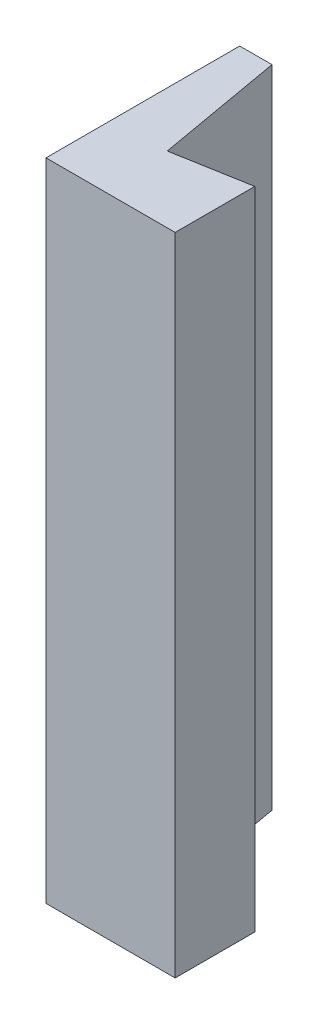
ISO-10303-21;
HEADER;
FILE_DESCRIPTION(('STEP AP214'),'2;1');
FILE_NAME('part.step','',(''),(''),'','','');
FILE_SCHEMA(('AUTOMOTIVE_DESIGN { 1 0 10303 214 1 1 1 1 }'));
ENDSEC;
DATA;
#1=APPLICATION_CONTEXT('core data for automotive mechanical design processes');
#2=APPLICATION_PROTOCOL_DEFINITION('international standard','automotive_design',2000,#1);
#3=PRODUCT_CONTEXT('',#1,'mechanical');
#4=PRODUCT('Part','Part','',(#3));
#5=PRODUCT_RELATED_PRODUCT_CATEGORY('part','',(#4));
#6=PRODUCT_DEFINITION_FORMATION('','',#4);
#7=PRODUCT_DEFINITION_CONTEXT('part definition',#1,'design');
#8=PRODUCT_DEFINITION('design','',#6,#7);
#9=PRODUCT_DEFINITION_SHAPE('','',#8);
#10=(LENGTH_UNIT() NAMED_UNIT(*) SI_UNIT(.MILLI.,.METRE.));
#11=(NAMED_UNIT(*) PLANE_ANGLE_UNIT() SI_UNIT($,.RADIAN.));
#12=(NAMED_UNIT(*) SI_UNIT($,.STERADIAN.) SOLID_ANGLE_UNIT());
#13=UNCERTAINTY_MEASURE_WITH_UNIT(LENGTH_MEASURE(1.E-05),#10,'distance_accuracy_value','');
#14=(GEOMETRIC_REPRESENTATION_CONTEXT(3) GLOBAL_UNCERTAINTY_ASSIGNED_CONTEXT((#13)) GLOBAL_UNIT_ASSIGNED_CONTEXT((#10,
#11,#12)) REPRESENTATION_CONTEXT('',''));
#15=CARTESIAN_POINT('',(0.,0.,0.));
#16=DIRECTION('',(0.,0.,1.));
#17=DIRECTION('',(1.,0.,0.));
#18=AXIS2_PLACEMENT_3D('',#15,#16,#17);
#19=CARTESIAN_POINT('',(-12.7,127.,19.05));
#20=DIRECTION('',(1.,0.,0.));
#21=DIRECTION('',(0.,0.,-1.));
#22=AXIS2_PLACEMENT_3D('',#19,#20,#21);
#23=PLANE('',#22);
#24=DIRECTION('',(0.,0.,1.));
#25=VECTOR('',#24,1.);
#26=CARTESIAN_POINT('',(-12.7,0.,19.05));
#27=LINE('',#26,#25);
#28=CARTESIAN_POINT('',(-12.7,0.,-19.05));
#29=VERTEX_POINT('',#28);
#30=CARTESIAN_POINT('',(-12.7,0.,19.05));
#31=VERTEX_POINT('',#30);
#32=EDGE_CURVE('E117',#29,#31,#27,.T.);
#33=ORIENTED_EDGE('',*,*,#32,.T.);
#34=DIRECTION('',(0.,-1.,0.));
#35=VECTOR('',#34,1.);
#36=CARTESIAN_POINT('',(-12.7,127.,19.05));
#37=LINE('',#36,#35);
#38=CARTESIAN_POINT('',(-12.7,127.,19.05));
#39=VERTEX_POINT('',#38);
#40=EDGE_CURVE('E11',#39,#31,#37,.T.);
#41=ORIENTED_EDGE('',*,*,#40,.F.);
#42=DIRECTION('',(0.,0.,1.));
#43=VECTOR('',#42,1.);
#44=CARTESIAN_POINT('',(-12.7,127.,19.05));
#45=LINE('',#44,#43);
#46=CARTESIAN_POINT('',(-12.7,127.,-19.05));
#47=VERTEX_POINT('',#46);
#48=EDGE_CURVE('E127',#47,#39,#45,.T.);
#49=ORIENTED_EDGE('',*,*,#48,.F.);
#50=DIRECTION('',(0.,-1.,0.));
#51=VECTOR('',#50,1.);
#52=CARTESIAN_POINT('',(-12.7,127.,-19.05));
#53=LINE('',#52,#51);
#54=EDGE_CURVE('E113',#47,#29,#53,.T.);
#55=ORIENTED_EDGE('',*,*,#54,.T.);
#56=EDGE_LOOP('',(#33,#41,#49,#55));
#57=FACE_BOUND('',#56,.T.);
#58=ADVANCED_FACE('F33',(#57),#23,.F.);
#59=CARTESIAN_POINT('',(-12.7,127.,19.05));
#60=DIRECTION('',(0.,0.,-1.));
#61=DIRECTION('',(-1.,0.,0.));
#62=AXIS2_PLACEMENT_3D('',#59,#60,#61);
#63=PLANE('',#62);
#64=DIRECTION('',(1.,0.,0.));
#65=VECTOR('',#64,1.);
#66=CARTESIAN_POINT('',(-12.7,0.,19.05));
#67=LINE('',#66,#65);
#68=CARTESIAN_POINT('',(12.7,0.,19.05));
#69=VERTEX_POINT('',#68);
#70=EDGE_CURVE('E120',#31,#69,#67,.T.);
#71=ORIENTED_EDGE('',*,*,#70,.T.);
#72=DIRECTION('',(0.,-1.,0.));
#73=VECTOR('',#72,1.);
#74=CARTESIAN_POINT('',(12.7,127.,19.05));
#75=LINE('',#74,#73);
#76=CARTESIAN_POINT('',(12.7,127.,19.05));
#77=VERTEX_POINT('',#76);
#78=EDGE_CURVE('E41',#77,#69,#75,.T.);
#79=ORIENTED_EDGE('',*,*,#78,.F.);
#80=DIRECTION('',(1.,0.,0.));
#81=VECTOR('',#80,1.);
#82=CARTESIAN_POINT('',(-12.7,127.,19.05));
#83=LINE('',#82,#81);
#84=EDGE_CURVE('E86',#39,#77,#83,.T.);
#85=ORIENTED_EDGE('',*,*,#84,.F.);
#86=ORIENTED_EDGE('',*,*,#40,.T.);
#87=EDGE_LOOP('',(#71,#79,#85,#86));
#88=FACE_BOUND('',#87,.T.);
#89=ADVANCED_FACE('F151',(#88),#63,.F.);
#90=CARTESIAN_POINT('',(12.7,127.,19.05));
#91=DIRECTION('',(-1.,0.,0.));
#92=DIRECTION('',(0.,0.,1.));
#93=AXIS2_PLACEMENT_3D('',#90,#91,#92);
#94=PLANE('',#93);
#95=DIRECTION('',(0.,0.,-1.));
#96=VECTOR('',#95,1.);
#97=CARTESIAN_POINT('',(12.7,0.,19.05));
#98=LINE('',#97,#96);
#99=CARTESIAN_POINT('',(12.7,0.,3.38280695940165));
#100=VERTEX_POINT('',#99);
#101=EDGE_CURVE('E122',#69,#100,#98,.T.);
#102=ORIENTED_EDGE('',*,*,#101,.T.);
#103=DIRECTION('',(0.,-1.,0.));
#104=VECTOR('',#103,1.);
#105=CARTESIAN_POINT('',(12.7,127.,3.38280695940165));
#106=LINE('',#105,#104);
#107=CARTESIAN_POINT('',(12.7,127.,3.38280695940165));
#108=VERTEX_POINT('',#107);
#109=EDGE_CURVE('E108',#108,#100,#106,.T.);
#110=ORIENTED_EDGE('',*,*,#109,.F.);
#111=DIRECTION('',(0.,0.,-1.));
#112=VECTOR('',#111,1.);
#113=CARTESIAN_POINT('',(12.7,127.,19.05));
#114=LINE('',#113,#112);
#115=EDGE_CURVE('E99',#77,#108,#114,.T.);
#116=ORIENTED_EDGE('',*,*,#115,.F.);
#117=ORIENTED_EDGE('',*,*,#78,.T.);
#118=EDGE_LOOP('',(#102,#110,#116,#117));
#119=FACE_BOUND('',#118,.T.);
#120=ADVANCED_FACE('F133',(#119),#94,.F.);
#121=CARTESIAN_POINT('',(-1.93933628726004,127.,5.9641169265101));
#122=DIRECTION('',(0.173648177666931,0.,0.984807753012208));
#123=DIRECTION('',(0.984807753012208,0.,-0.173648177666931));
#124=AXIS2_PLACEMENT_3D('',#121,#122,#123);
#125=PLANE('',#124);
#126=DIRECTION('',(-0.984807753012208,0.,0.173648177666931));
#127=VECTOR('',#126,1.);
#128=CARTESIAN_POINT('',(-1.93933628726004,0.,5.9641169265101));
#129=LINE('',#128,#127);
#130=CARTESIAN_POINT('',(-1.93933628726004,0.,5.9641169265101));
#131=VERTEX_POINT('',#130);
#132=EDGE_CURVE('E107',#100,#131,#129,.T.);
#133=ORIENTED_EDGE('',*,*,#132,.T.);
#134=DIRECTION('',(0.,-1.,0.));
#135=VECTOR('',#134,1.);
#136=CARTESIAN_POINT('',(-1.93933628726004,127.,5.9641169265101));
#137=LINE('',#136,#135);
#138=CARTESIAN_POINT('',(-1.93933628726004,127.,5.9641169265101));
#139=VERTEX_POINT('',#138);
#140=EDGE_CURVE('E104',#139,#131,#137,.T.);
#141=ORIENTED_EDGE('',*,*,#140,.F.);
#142=DIRECTION('',(-0.984807753012208,0.,0.173648177666931));
#143=VECTOR('',#142,1.);
#144=CARTESIAN_POINT('',(-1.93933628726004,127.,5.9641169265101));
#145=LINE('',#144,#143);
#146=EDGE_CURVE('E93',#108,#139,#145,.T.);
#147=ORIENTED_EDGE('',*,*,#146,.F.);
#148=ORIENTED_EDGE('',*,*,#109,.T.);
#149=EDGE_LOOP('',(#133,#141,#147,#148));
#150=FACE_BOUND('',#149,.T.);
#151=ADVANCED_FACE('F105',(#150),#125,.F.);
#152=CARTESIAN_POINT('',(-6.34999999999999,127.,-19.05));
#153=DIRECTION('',(-0.984807753012209,0.,0.173648177666927));
#154=DIRECTION('',(0.173648177666927,0.,0.984807753012209));
#155=AXIS2_PLACEMENT_3D('',#152,#153,#154);
#156=PLANE('',#155);
#157=DIRECTION('',(-0.173648177666927,0.,-0.984807753012209));
#158=VECTOR('',#157,1.);
#159=CARTESIAN_POINT('',(-6.34999999999999,0.,-19.05));
#160=LINE('',#159,#158);
#161=CARTESIAN_POINT('',(-6.34999999999999,0.,-19.05));
#162=VERTEX_POINT('',#161);
#163=EDGE_CURVE('E72',#131,#162,#160,.T.);
#164=ORIENTED_EDGE('',*,*,#163,.T.);
#165=DIRECTION('',(0.,-1.,0.));
#166=VECTOR('',#165,1.);
#167=CARTESIAN_POINT('',(-6.34999999999999,127.,-19.05));
#168=LINE('',#167,#166);
#169=CARTESIAN_POINT('',(-6.34999999999999,127.,-19.05));
#170=VERTEX_POINT('',#169);
#171=EDGE_CURVE('E109',#170,#162,#168,.T.);
#172=ORIENTED_EDGE('',*,*,#171,.F.);
#173=DIRECTION('',(-0.173648177666927,0.,-0.984807753012209));
#174=VECTOR('',#173,1.);
#175=CARTESIAN_POINT('',(-6.34999999999999,127.,-19.05));
#176=LINE('',#175,#174);
#177=EDGE_CURVE('E97',#139,#170,#176,.T.);
#178=ORIENTED_EDGE('',*,*,#177,.F.);
#179=ORIENTED_EDGE('',*,*,#140,.T.);
#180=EDGE_LOOP('',(#164,#172,#178,#179));
#181=FACE_BOUND('',#180,.T.);
#182=ADVANCED_FACE('F111',(#181),#156,.F.);
#183=CARTESIAN_POINT('',(-12.7,127.,-19.05));
#184=DIRECTION('',(0.,0.,1.));
#185=DIRECTION('',(1.,0.,0.));
#186=AXIS2_PLACEMENT_3D('',#183,#184,#185);
#187=PLANE('',#186);
#188=DIRECTION('',(-1.,0.,0.));
#189=VECTOR('',#188,1.);
#190=CARTESIAN_POINT('',(-12.7,0.,-19.05));
#191=LINE('',#190,#189);
#192=EDGE_CURVE('E78',#162,#29,#191,.T.);
#193=ORIENTED_EDGE('',*,*,#192,.T.);
#194=ORIENTED_EDGE('',*,*,#54,.F.);
#195=DIRECTION('',(-1.,0.,0.));
#196=VECTOR('',#195,1.);
#197=CARTESIAN_POINT('',(-12.7,127.,-19.05));
#198=LINE('',#197,#196);
#199=EDGE_CURVE('E49',#170,#47,#198,.T.);
#200=ORIENTED_EDGE('',*,*,#199,.F.);
#201=ORIENTED_EDGE('',*,*,#171,.T.);
#202=EDGE_LOOP('',(#193,#194,#200,#201));
#203=FACE_BOUND('',#202,.T.);
#204=ADVANCED_FACE('F140',(#203),#187,.F.);
#205=CARTESIAN_POINT('',(0.,127.,0.));
#206=DIRECTION('',(0.,-1.,0.));
#207=DIRECTION('',(0.,0.,-1.));
#208=AXIS2_PLACEMENT_3D('',#205,#206,#207);
#209=PLANE('',#208);
#210=ORIENTED_EDGE('',*,*,#48,.T.);
#211=ORIENTED_EDGE('',*,*,#84,.T.);
#212=ORIENTED_EDGE('',*,*,#115,.T.);
#213=ORIENTED_EDGE('',*,*,#146,.T.);
#214=ORIENTED_EDGE('',*,*,#177,.T.);
#215=ORIENTED_EDGE('',*,*,#199,.T.);
#216=EDGE_LOOP('',(#210,#211,#212,#213,#214,#215));
#217=FACE_BOUND('',#216,.T.);
#218=ADVANCED_FACE('F95',(#217),#209,.F.);
#219=CARTESIAN_POINT('',(0.,0.,0.));
#220=DIRECTION('',(0.,-1.,0.));
#221=DIRECTION('',(0.,0.,-1.));
#222=AXIS2_PLACEMENT_3D('',#219,#220,#221);
#223=PLANE('',#222);
#224=ORIENTED_EDGE('',*,*,#32,.F.);
#225=ORIENTED_EDGE('',*,*,#192,.F.);
#226=ORIENTED_EDGE('',*,*,#163,.F.);
#227=ORIENTED_EDGE('',*,*,#132,.F.);
#228=ORIENTED_EDGE('',*,*,#101,.F.);
#229=ORIENTED_EDGE('',*,*,#70,.F.);
#230=EDGE_LOOP('',(#224,#225,#226,#227,#228,#229));
#231=FACE_BOUND('',#230,.T.);
#232=ADVANCED_FACE('F136',(#231),#223,.T.);
#233=CLOSED_SHELL('',(#58,#89,#120,#151,#182,#204,#218,#232));
#234=MANIFOLD_SOLID_BREP('B2',#233);
#235=ADVANCED_BREP_SHAPE_REPRESENTATION('',(#18,#234),#14);
#236=SHAPE_DEFINITION_REPRESENTATION(#9,#235);
ENDSEC;
END-ISO-10303-21;
